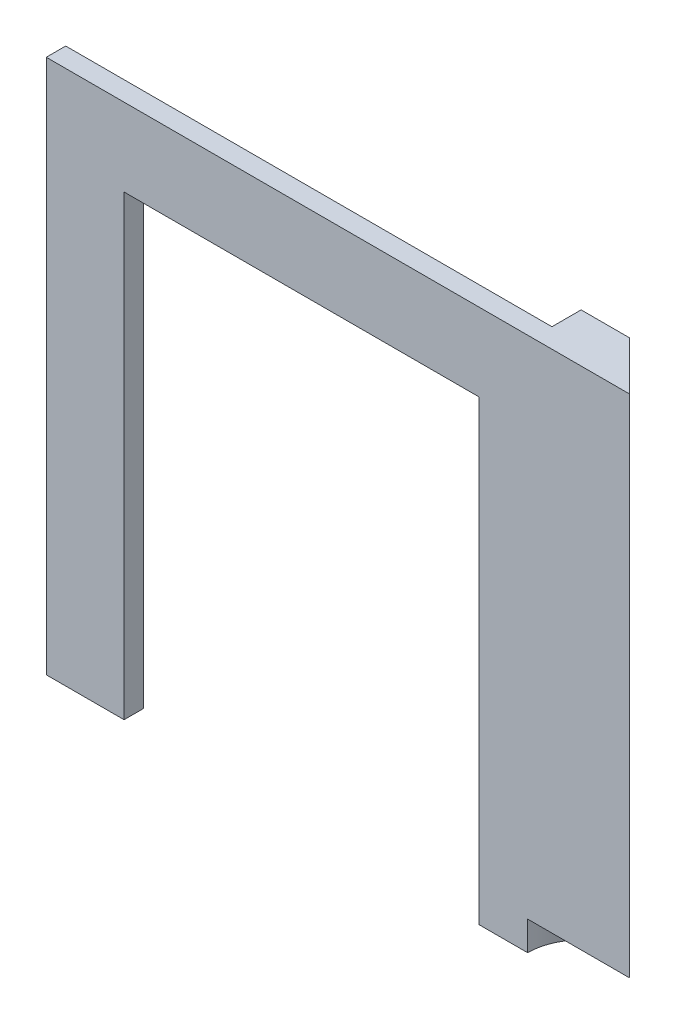
ISO-10303-21;
HEADER;
FILE_DESCRIPTION(('STEP AP214'),'2;1');
FILE_NAME('part.step','',(''),(''),'','','');
FILE_SCHEMA(('AUTOMOTIVE_DESIGN { 1 0 10303 214 1 1 1 1 }'));
ENDSEC;
DATA;
#1=APPLICATION_CONTEXT('core data for automotive mechanical design processes');
#2=APPLICATION_PROTOCOL_DEFINITION('international standard','automotive_design',2000,#1);
#3=PRODUCT_CONTEXT('',#1,'mechanical');
#4=PRODUCT('Part','Part','',(#3));
#5=PRODUCT_RELATED_PRODUCT_CATEGORY('part','',(#4));
#6=PRODUCT_DEFINITION_FORMATION('','',#4);
#7=PRODUCT_DEFINITION_CONTEXT('part definition',#1,'design');
#8=PRODUCT_DEFINITION('design','',#6,#7);
#9=PRODUCT_DEFINITION_SHAPE('','',#8);
#10=(LENGTH_UNIT() NAMED_UNIT(*) SI_UNIT(.MILLI.,.METRE.));
#11=(NAMED_UNIT(*) PLANE_ANGLE_UNIT() SI_UNIT($,.RADIAN.));
#12=(NAMED_UNIT(*) SI_UNIT($,.STERADIAN.) SOLID_ANGLE_UNIT());
#13=UNCERTAINTY_MEASURE_WITH_UNIT(LENGTH_MEASURE(1.E-05),#10,'distance_accuracy_value','');
#14=(GEOMETRIC_REPRESENTATION_CONTEXT(3) GLOBAL_UNCERTAINTY_ASSIGNED_CONTEXT((#13)) GLOBAL_UNIT_ASSIGNED_CONTEXT((#10,
#11,#12)) REPRESENTATION_CONTEXT('',''));
#15=CARTESIAN_POINT('',(0.,0.,0.));
#16=DIRECTION('',(0.,0.,1.));
#17=DIRECTION('',(1.,0.,0.));
#18=AXIS2_PLACEMENT_3D('',#15,#16,#17);
#19=CARTESIAN_POINT('',(34.0000000000006,55.,2.49999999999978));
#20=DIRECTION('',(-0.707106781186551,0.,0.707106781186544));
#21=DIRECTION('',(0.707106781186544,0.,0.707106781186551));
#22=AXIS2_PLACEMENT_3D('',#19,#20,#21);
#23=PLANE('',#22);
#24=DIRECTION('',(0.707106781186544,0.,0.707106781186551));
#25=VECTOR('',#24,1.);
#26=CARTESIAN_POINT('',(34.0000000000006,3.,2.49999999999978));
#27=LINE('',#26,#25);
#28=CARTESIAN_POINT('',(29.0000000000009,3.,-2.49999999999996));
#29=VERTEX_POINT('',#28);
#30=CARTESIAN_POINT('',(34.0000000000006,3.,2.49999999999978));
#31=VERTEX_POINT('',#30);
#32=EDGE_CURVE('E182',#29,#31,#27,.T.);
#33=ORIENTED_EDGE('',*,*,#32,.F.);
#34=DIRECTION('',(0.,-1.,0.));
#35=VECTOR('',#34,1.);
#36=CARTESIAN_POINT('',(29.0000000000009,55.,-2.49999999999996));
#37=LINE('',#36,#35);
#38=CARTESIAN_POINT('',(29.0000000000009,55.,-2.49999999999996));
#39=VERTEX_POINT('',#38);
#40=EDGE_CURVE('E174',#39,#29,#37,.T.);
#41=ORIENTED_EDGE('',*,*,#40,.F.);
#42=DIRECTION('',(-0.707106781186544,0.,-0.707106781186551));
#43=VECTOR('',#42,1.);
#44=CARTESIAN_POINT('',(34.0000000000006,55.,2.49999999999978));
#45=LINE('',#44,#43);
#46=CARTESIAN_POINT('',(34.0000000000006,55.,2.49999999999978));
#47=VERTEX_POINT('',#46);
#48=EDGE_CURVE('E197',#47,#39,#45,.T.);
#49=ORIENTED_EDGE('',*,*,#48,.F.);
#50=DIRECTION('',(0.,-1.,0.));
#51=VECTOR('',#50,1.);
#52=CARTESIAN_POINT('',(34.0000000000006,55.,2.49999999999978));
#53=LINE('',#52,#51);
#54=EDGE_CURVE('E177',#47,#31,#53,.T.);
#55=ORIENTED_EDGE('',*,*,#54,.T.);
#56=EDGE_LOOP('',(#33,#41,#49,#55));
#57=FACE_BOUND('',#56,.T.);
#58=ADVANCED_FACE('F32',(#57),#23,.F.);
#59=CARTESIAN_POINT('',(0.,0.,0.));
#60=DIRECTION('',(0.,-1.,0.));
#61=DIRECTION('',(0.,0.,-1.));
#62=AXIS2_PLACEMENT_3D('',#59,#60,#61);
#63=PLANE('',#62);
#64=CARTESIAN_POINT('',(29.0000000000049,0.,2.50000000000047));
#65=DIRECTION('',(0.,-1.,0.));
#66=DIRECTION('',(0.,0.,-1.));
#67=AXIS2_PLACEMENT_3D('',#64,#65,#66);
#68=CIRCLE('',#67,5.5);
#69=CARTESIAN_POINT('',(23.5000000000049,0.,2.49999999999978));
#70=VERTEX_POINT('',#69);
#71=CARTESIAN_POINT('',(26.7087121525279,0.,-2.49999999999996));
#72=VERTEX_POINT('',#71);
#73=EDGE_CURVE('E127',#70,#72,#68,.T.);
#74=ORIENTED_EDGE('',*,*,#73,.F.);
#75=DIRECTION('',(1.,0.,0.));
#76=VECTOR('',#75,1.);
#77=CARTESIAN_POINT('',(-26.0000000000006,0.,2.49999999999978));
#78=LINE('',#77,#76);
#79=CARTESIAN_POINT('',(18.4999999999994,0.,2.49999999999978));
#80=VERTEX_POINT('',#79);
#81=EDGE_CURVE('E139',#80,#70,#78,.T.);
#82=ORIENTED_EDGE('',*,*,#81,.F.);
#83=DIRECTION('',(0.,0.,1.));
#84=VECTOR('',#83,1.);
#85=CARTESIAN_POINT('',(18.4999999999994,0.,-2.49999999999996));
#86=LINE('',#85,#84);
#87=CARTESIAN_POINT('',(18.4999999999994,0.,-2.49999999999996));
#88=VERTEX_POINT('',#87);
#89=EDGE_CURVE('E158',#88,#80,#86,.T.);
#90=ORIENTED_EDGE('',*,*,#89,.F.);
#91=DIRECTION('',(-1.,0.,0.));
#92=VECTOR('',#91,1.);
#93=CARTESIAN_POINT('',(29.0000000000009,0.,-2.49999999999996));
#94=LINE('',#93,#92);
#95=EDGE_CURVE('E140',#72,#88,#94,.T.);
#96=ORIENTED_EDGE('',*,*,#95,.F.);
#97=EDGE_LOOP('',(#74,#82,#90,#96));
#98=FACE_BOUND('',#97,.T.);
#99=ADVANCED_FACE('F137',(#98),#63,.T.);
#100=CARTESIAN_POINT('',(-26.0000000000006,55.,2.49999999999978));
#101=DIRECTION('',(0.,0.,-1.));
#102=DIRECTION('',(-1.,0.,0.));
#103=AXIS2_PLACEMENT_3D('',#100,#101,#102);
#104=PLANE('',#103);
#105=ORIENTED_EDGE('',*,*,#81,.T.);
#106=DIRECTION('',(0.,-1.,0.));
#107=VECTOR('',#106,1.);
#108=CARTESIAN_POINT('',(23.5000000000049,3.,2.49999999999978));
#109=LINE('',#108,#107);
#110=CARTESIAN_POINT('',(23.5000000000049,3.,2.49999999999978));
#111=VERTEX_POINT('',#110);
#112=EDGE_CURVE('E124',#70,#111,#109,.F.);
#113=ORIENTED_EDGE('',*,*,#112,.T.);
#114=DIRECTION('',(-1.,0.,0.));
#115=VECTOR('',#114,1.);
#116=CARTESIAN_POINT('',(-26.0000000000006,3.,2.49999999999978));
#117=LINE('',#116,#115);
#118=EDGE_CURVE('E132',#31,#111,#117,.T.);
#119=ORIENTED_EDGE('',*,*,#118,.F.);
#120=ORIENTED_EDGE('',*,*,#54,.F.);
#121=DIRECTION('',(1.,0.,0.));
#122=VECTOR('',#121,1.);
#123=CARTESIAN_POINT('',(-26.0000000000006,55.,2.49999999999978));
#124=LINE('',#123,#122);
#125=CARTESIAN_POINT('',(-26.0000000000006,55.,2.49999999999978));
#126=VERTEX_POINT('',#125);
#127=EDGE_CURVE('E164',#126,#47,#124,.T.);
#128=ORIENTED_EDGE('',*,*,#127,.F.);
#129=DIRECTION('',(0.,-1.,0.));
#130=VECTOR('',#129,1.);
#131=CARTESIAN_POINT('',(-26.0000000000006,55.,2.49999999999978));
#132=LINE('',#131,#130);
#133=CARTESIAN_POINT('',(-26.0000000000006,0.,2.49999999999978));
#134=VERTEX_POINT('',#133);
#135=EDGE_CURVE('E165',#126,#134,#132,.T.);
#136=ORIENTED_EDGE('',*,*,#135,.T.);
#137=CARTESIAN_POINT('',(-18.0000000000006,0.,2.49999999999978));
#138=VERTEX_POINT('',#137);
#139=EDGE_CURVE('E146',#134,#138,#78,.T.);
#140=ORIENTED_EDGE('',*,*,#139,.T.);
#141=DIRECTION('',(0.,1.,0.));
#142=VECTOR('',#141,1.);
#143=CARTESIAN_POINT('',(-18.0000000000006,0.,2.49999999999979));
#144=LINE('',#143,#142);
#145=CARTESIAN_POINT('',(-18.0000000000006,47.,2.49999999999979));
#146=VERTEX_POINT('',#145);
#147=EDGE_CURVE('E215',#138,#146,#144,.T.);
#148=ORIENTED_EDGE('',*,*,#147,.T.);
#149=DIRECTION('',(1.,0.,0.));
#150=VECTOR('',#149,1.);
#151=CARTESIAN_POINT('',(18.4999999999994,47.,2.49999999999978));
#152=LINE('',#151,#150);
#153=CARTESIAN_POINT('',(18.4999999999994,47.,2.49999999999978));
#154=VERTEX_POINT('',#153);
#155=EDGE_CURVE('E205',#146,#154,#152,.T.);
#156=ORIENTED_EDGE('',*,*,#155,.T.);
#157=DIRECTION('',(0.,-1.,0.));
#158=VECTOR('',#157,1.);
#159=CARTESIAN_POINT('',(18.4999999999994,0.,2.49999999999978));
#160=LINE('',#159,#158);
#161=EDGE_CURVE('E145',#154,#80,#160,.T.);
#162=ORIENTED_EDGE('',*,*,#161,.T.);
#163=EDGE_LOOP('',(#105,#113,#119,#120,#128,#136,#140,#148,#156,#162));
#164=FACE_BOUND('',#163,.T.);
#165=ADVANCED_FACE('F34',(#164),#104,.F.);
#166=CARTESIAN_POINT('',(29.0000000000009,55.,-2.49999999999996));
#167=DIRECTION('',(0.,0.,1.));
#168=DIRECTION('',(1.,0.,0.));
#169=AXIS2_PLACEMENT_3D('',#166,#167,#168);
#170=PLANE('',#169);
#171=DIRECTION('',(1.,0.,0.));
#172=VECTOR('',#171,1.);
#173=CARTESIAN_POINT('',(29.0000000000009,3.,-2.49999999999996));
#174=LINE('',#173,#172);
#175=CARTESIAN_POINT('',(26.7087121525279,3.,-2.49999999999996));
#176=VERTEX_POINT('',#175);
#177=EDGE_CURVE('E40',#176,#29,#174,.T.);
#178=ORIENTED_EDGE('',*,*,#177,.F.);
#179=DIRECTION('',(0.,-1.,0.));
#180=VECTOR('',#179,1.);
#181=CARTESIAN_POINT('',(26.7087121525279,3.,-2.49999999999996));
#182=LINE('',#181,#180);
#183=EDGE_CURVE('E11',#176,#72,#182,.T.);
#184=ORIENTED_EDGE('',*,*,#183,.T.);
#185=ORIENTED_EDGE('',*,*,#95,.T.);
#186=DIRECTION('',(0.,-1.,0.));
#187=VECTOR('',#186,1.);
#188=CARTESIAN_POINT('',(18.4999999999994,55.,-2.49999999999996));
#189=LINE('',#188,#187);
#190=CARTESIAN_POINT('',(18.4999999999994,47.,-2.49999999999996));
#191=VERTEX_POINT('',#190);
#192=EDGE_CURVE('E171',#191,#88,#189,.T.);
#193=ORIENTED_EDGE('',*,*,#192,.F.);
#194=DIRECTION('',(-1.,0.,0.));
#195=VECTOR('',#194,1.);
#196=CARTESIAN_POINT('',(18.4999999999994,47.,-2.49999999999996));
#197=LINE('',#196,#195);
#198=CARTESIAN_POINT('',(24.0000000000006,47.,-2.49999999999996));
#199=VERTEX_POINT('',#198);
#200=EDGE_CURVE('E222',#199,#191,#197,.T.);
#201=ORIENTED_EDGE('',*,*,#200,.F.);
#202=DIRECTION('',(0.,-1.,0.));
#203=VECTOR('',#202,1.);
#204=CARTESIAN_POINT('',(24.0000000000006,55.,-2.49999999999996));
#205=LINE('',#204,#203);
#206=CARTESIAN_POINT('',(24.0000000000006,55.,-2.49999999999996));
#207=VERTEX_POINT('',#206);
#208=EDGE_CURVE('E131',#207,#199,#205,.T.);
#209=ORIENTED_EDGE('',*,*,#208,.F.);
#210=DIRECTION('',(-1.,0.,0.));
#211=VECTOR('',#210,1.);
#212=CARTESIAN_POINT('',(29.0000000000009,55.,-2.49999999999996));
#213=LINE('',#212,#211);
#214=EDGE_CURVE('E192',#39,#207,#213,.T.);
#215=ORIENTED_EDGE('',*,*,#214,.F.);
#216=ORIENTED_EDGE('',*,*,#40,.T.);
#217=EDGE_LOOP('',(#178,#184,#185,#193,#201,#209,#215,#216));
#218=FACE_BOUND('',#217,.T.);
#219=ADVANCED_FACE('F189',(#218),#170,.F.);
#220=CARTESIAN_POINT('',(18.4999999999994,55.,-2.49999999999996));
#221=DIRECTION('',(1.,0.,0.));
#222=DIRECTION('',(0.,0.,-1.));
#223=AXIS2_PLACEMENT_3D('',#220,#221,#222);
#224=PLANE('',#223);
#225=DIRECTION('',(0.,0.,-1.));
#226=VECTOR('',#225,1.);
#227=CARTESIAN_POINT('',(18.4999999999994,47.,2.49999999999978));
#228=LINE('',#227,#226);
#229=CARTESIAN_POINT('',(18.4999999999994,47.,0.500000000000273));
#230=VERTEX_POINT('',#229);
#231=EDGE_CURVE('E147',#154,#230,#228,.T.);
#232=ORIENTED_EDGE('',*,*,#231,.T.);
#233=DIRECTION('',(0.,0.,-1.));
#234=VECTOR('',#233,1.);
#235=CARTESIAN_POINT('',(18.4999999999994,47.,10.2082439194748));
#236=LINE('',#235,#234);
#237=EDGE_CURVE('E213',#230,#191,#236,.T.);
#238=ORIENTED_EDGE('',*,*,#237,.T.);
#239=ORIENTED_EDGE('',*,*,#192,.T.);
#240=ORIENTED_EDGE('',*,*,#89,.T.);
#241=ORIENTED_EDGE('',*,*,#161,.F.);
#242=EDGE_LOOP('',(#232,#238,#239,#240,#241));
#243=FACE_BOUND('',#242,.T.);
#244=ADVANCED_FACE('F254',(#243),#224,.F.);
#245=CARTESIAN_POINT('',(18.4999999999994,55.,0.500000000000272));
#246=DIRECTION('',(0.,0.,1.));
#247=DIRECTION('',(1.,0.,0.));
#248=AXIS2_PLACEMENT_3D('',#245,#246,#247);
#249=PLANE('',#248);
#250=DIRECTION('',(-1.,0.,0.));
#251=VECTOR('',#250,1.);
#252=CARTESIAN_POINT('',(18.4999999999994,55.,0.500000000000272));
#253=LINE('',#252,#251);
#254=CARTESIAN_POINT('',(24.0000000000006,55.,0.500000000000273));
#255=VERTEX_POINT('',#254);
#256=CARTESIAN_POINT('',(-26.0000000000006,55.,0.500000000000278));
#257=VERTEX_POINT('',#256);
#258=EDGE_CURVE('E55',#255,#257,#253,.T.);
#259=ORIENTED_EDGE('',*,*,#258,.F.);
#260=DIRECTION('',(0.,-1.,0.));
#261=VECTOR('',#260,1.);
#262=CARTESIAN_POINT('',(24.0000000000006,55.,0.500000000000273));
#263=LINE('',#262,#261);
#264=CARTESIAN_POINT('',(24.0000000000006,47.,0.500000000000273));
#265=VERTEX_POINT('',#264);
#266=EDGE_CURVE('E221',#255,#265,#263,.T.);
#267=ORIENTED_EDGE('',*,*,#266,.T.);
#268=DIRECTION('',(-1.,0.,0.));
#269=VECTOR('',#268,1.);
#270=CARTESIAN_POINT('',(18.4999999999994,47.,0.500000000000273));
#271=LINE('',#270,#269);
#272=EDGE_CURVE('E225',#265,#230,#271,.T.);
#273=ORIENTED_EDGE('',*,*,#272,.T.);
#274=DIRECTION('',(1.,0.,0.));
#275=VECTOR('',#274,1.);
#276=CARTESIAN_POINT('',(18.4999999999994,47.,0.500000000000272));
#277=LINE('',#276,#275);
#278=CARTESIAN_POINT('',(-18.0000000000006,47.,0.500000000000277));
#279=VERTEX_POINT('',#278);
#280=EDGE_CURVE('E207',#279,#230,#277,.T.);
#281=ORIENTED_EDGE('',*,*,#280,.F.);
#282=DIRECTION('',(0.,1.,0.));
#283=VECTOR('',#282,1.);
#284=CARTESIAN_POINT('',(-18.0000000000006,0.,0.500000000000277));
#285=LINE('',#284,#283);
#286=CARTESIAN_POINT('',(-18.0000000000006,0.,0.500000000000277));
#287=VERTEX_POINT('',#286);
#288=EDGE_CURVE('E210',#287,#279,#285,.T.);
#289=ORIENTED_EDGE('',*,*,#288,.F.);
#290=DIRECTION('',(-1.,0.,0.));
#291=VECTOR('',#290,1.);
#292=CARTESIAN_POINT('',(18.4999999999994,0.,0.500000000000272));
#293=LINE('',#292,#291);
#294=CARTESIAN_POINT('',(-26.0000000000006,0.,0.500000000000278));
#295=VERTEX_POINT('',#294);
#296=EDGE_CURVE('E160',#287,#295,#293,.T.);
#297=ORIENTED_EDGE('',*,*,#296,.T.);
#298=DIRECTION('',(0.,-1.,0.));
#299=VECTOR('',#298,1.);
#300=CARTESIAN_POINT('',(-26.0000000000006,55.,0.500000000000278));
#301=LINE('',#300,#299);
#302=EDGE_CURVE('E168',#257,#295,#301,.T.);
#303=ORIENTED_EDGE('',*,*,#302,.F.);
#304=EDGE_LOOP('',(#259,#267,#273,#281,#289,#297,#303));
#305=FACE_BOUND('',#304,.T.);
#306=ADVANCED_FACE('F261',(#305),#249,.F.);
#307=CARTESIAN_POINT('',(-26.0000000000006,55.,0.500000000000278));
#308=DIRECTION('',(1.,0.,0.));
#309=DIRECTION('',(0.,0.,-1.));
#310=AXIS2_PLACEMENT_3D('',#307,#308,#309);
#311=PLANE('',#310);
#312=DIRECTION('',(0.,0.,1.));
#313=VECTOR('',#312,1.);
#314=CARTESIAN_POINT('',(-26.0000000000006,0.,0.500000000000278));
#315=LINE('',#314,#313);
#316=EDGE_CURVE('E162',#295,#134,#315,.T.);
#317=ORIENTED_EDGE('',*,*,#316,.T.);
#318=ORIENTED_EDGE('',*,*,#135,.F.);
#319=DIRECTION('',(0.,0.,1.));
#320=VECTOR('',#319,1.);
#321=CARTESIAN_POINT('',(-26.0000000000006,55.,0.500000000000278));
#322=LINE('',#321,#320);
#323=EDGE_CURVE('E155',#257,#126,#322,.T.);
#324=ORIENTED_EDGE('',*,*,#323,.F.);
#325=ORIENTED_EDGE('',*,*,#302,.T.);
#326=EDGE_LOOP('',(#317,#318,#324,#325));
#327=FACE_BOUND('',#326,.T.);
#328=ADVANCED_FACE('F240',(#327),#311,.F.);
#329=CARTESIAN_POINT('',(0.,55.,0.));
#330=DIRECTION('',(0.,-1.,0.));
#331=DIRECTION('',(0.,0.,-1.));
#332=AXIS2_PLACEMENT_3D('',#329,#330,#331);
#333=PLANE('',#332);
#334=DIRECTION('',(0.,0.,-1.));
#335=VECTOR('',#334,1.);
#336=CARTESIAN_POINT('',(24.0000000000006,55.,10.2082439194748));
#337=LINE('',#336,#335);
#338=EDGE_CURVE('E219',#255,#207,#337,.T.);
#339=ORIENTED_EDGE('',*,*,#338,.F.);
#340=ORIENTED_EDGE('',*,*,#258,.T.);
#341=ORIENTED_EDGE('',*,*,#323,.T.);
#342=ORIENTED_EDGE('',*,*,#127,.T.);
#343=ORIENTED_EDGE('',*,*,#48,.T.);
#344=ORIENTED_EDGE('',*,*,#214,.T.);
#345=EDGE_LOOP('',(#339,#340,#341,#342,#343,#344));
#346=FACE_BOUND('',#345,.T.);
#347=ADVANCED_FACE('F237',(#346),#333,.F.);
#348=DIRECTION('',(0.,0.,-1.));
#349=VECTOR('',#348,1.);
#350=CARTESIAN_POINT('',(-18.0000000000006,0.,2.49999999999979));
#351=LINE('',#350,#349);
#352=EDGE_CURVE('E203',#138,#287,#351,.T.);
#353=ORIENTED_EDGE('',*,*,#352,.F.);
#354=ORIENTED_EDGE('',*,*,#139,.F.);
#355=ORIENTED_EDGE('',*,*,#316,.F.);
#356=ORIENTED_EDGE('',*,*,#296,.F.);
#357=EDGE_LOOP('',(#353,#354,#355,#356));
#358=FACE_BOUND('',#357,.T.);
#359=ADVANCED_FACE('F245',(#358),#63,.T.);
#360=CARTESIAN_POINT('',(18.4999999999994,47.,2.49999999999978));
#361=DIRECTION('',(0.,1.,0.));
#362=DIRECTION('',(0.,0.,1.));
#363=AXIS2_PLACEMENT_3D('',#360,#361,#362);
#364=PLANE('',#363);
#365=ORIENTED_EDGE('',*,*,#280,.T.);
#366=ORIENTED_EDGE('',*,*,#231,.F.);
#367=ORIENTED_EDGE('',*,*,#155,.F.);
#368=DIRECTION('',(0.,0.,-1.));
#369=VECTOR('',#368,1.);
#370=CARTESIAN_POINT('',(-18.0000000000006,47.,2.49999999999979));
#371=LINE('',#370,#369);
#372=EDGE_CURVE('E151',#146,#279,#371,.T.);
#373=ORIENTED_EDGE('',*,*,#372,.T.);
#374=EDGE_LOOP('',(#365,#366,#367,#373));
#375=FACE_BOUND('',#374,.T.);
#376=ADVANCED_FACE('F252',(#375),#364,.F.);
#377=CARTESIAN_POINT('',(-18.0000000000006,0.,2.49999999999979));
#378=DIRECTION('',(-1.,0.,0.));
#379=DIRECTION('',(0.,0.,1.));
#380=AXIS2_PLACEMENT_3D('',#377,#378,#379);
#381=PLANE('',#380);
#382=ORIENTED_EDGE('',*,*,#288,.T.);
#383=ORIENTED_EDGE('',*,*,#372,.F.);
#384=ORIENTED_EDGE('',*,*,#147,.F.);
#385=ORIENTED_EDGE('',*,*,#352,.T.);
#386=EDGE_LOOP('',(#382,#383,#384,#385));
#387=FACE_BOUND('',#386,.T.);
#388=ADVANCED_FACE('F248',(#387),#381,.F.);
#389=CARTESIAN_POINT('',(24.0000000000006,55.,10.2082439194748));
#390=DIRECTION('',(1.,0.,0.));
#391=DIRECTION('',(0.,0.,-1.));
#392=AXIS2_PLACEMENT_3D('',#389,#390,#391);
#393=PLANE('',#392);
#394=ORIENTED_EDGE('',*,*,#338,.T.);
#395=ORIENTED_EDGE('',*,*,#208,.T.);
#396=DIRECTION('',(0.,0.,-1.));
#397=VECTOR('',#396,1.);
#398=CARTESIAN_POINT('',(24.0000000000006,47.,10.2082439194748));
#399=LINE('',#398,#397);
#400=EDGE_CURVE('E223',#265,#199,#399,.T.);
#401=ORIENTED_EDGE('',*,*,#400,.F.);
#402=ORIENTED_EDGE('',*,*,#266,.F.);
#403=EDGE_LOOP('',(#394,#395,#401,#402));
#404=FACE_BOUND('',#403,.T.);
#405=ADVANCED_FACE('F260',(#404),#393,.F.);
#406=CARTESIAN_POINT('',(18.4999999999994,47.,10.2082439194748));
#407=DIRECTION('',(0.,-1.,0.));
#408=DIRECTION('',(0.,0.,-1.));
#409=AXIS2_PLACEMENT_3D('',#406,#407,#408);
#410=PLANE('',#409);
#411=ORIENTED_EDGE('',*,*,#400,.T.);
#412=ORIENTED_EDGE('',*,*,#200,.T.);
#413=ORIENTED_EDGE('',*,*,#237,.F.);
#414=ORIENTED_EDGE('',*,*,#272,.F.);
#415=EDGE_LOOP('',(#411,#412,#413,#414));
#416=FACE_BOUND('',#415,.T.);
#417=ADVANCED_FACE('F257',(#416),#410,.F.);
#418=CARTESIAN_POINT('',(29.0000000000049,3.,2.50000000000047));
#419=DIRECTION('',(0.,-1.,0.));
#420=DIRECTION('',(0.,0.,-1.));
#421=AXIS2_PLACEMENT_3D('',#418,#419,#420);
#422=CYLINDRICAL_SURFACE('',#421,5.5);
#423=ORIENTED_EDGE('',*,*,#73,.T.);
#424=ORIENTED_EDGE('',*,*,#183,.F.);
#425=CARTESIAN_POINT('',(29.0000000000049,3.,2.50000000000047));
#426=DIRECTION('',(0.,-1.,0.));
#427=DIRECTION('',(0.,0.,-1.));
#428=AXIS2_PLACEMENT_3D('',#425,#426,#427);
#429=CIRCLE('',#428,5.5);
#430=EDGE_CURVE('E47',#111,#176,#429,.T.);
#431=ORIENTED_EDGE('',*,*,#430,.F.);
#432=ORIENTED_EDGE('',*,*,#112,.F.);
#433=EDGE_LOOP('',(#423,#424,#431,#432));
#434=FACE_BOUND('',#433,.T.);
#435=ADVANCED_FACE('F126',(#434),#422,.F.);
#436=CARTESIAN_POINT('',(29.0000000000049,3.,2.50000000000047));
#437=DIRECTION('',(0.,-1.,0.));
#438=DIRECTION('',(0.,0.,-1.));
#439=AXIS2_PLACEMENT_3D('',#436,#437,#438);
#440=PLANE('',#439);
#441=ORIENTED_EDGE('',*,*,#118,.T.);
#442=ORIENTED_EDGE('',*,*,#430,.T.);
#443=ORIENTED_EDGE('',*,*,#177,.T.);
#444=ORIENTED_EDGE('',*,*,#32,.T.);
#445=EDGE_LOOP('',(#441,#442,#443,#444));
#446=FACE_BOUND('',#445,.T.);
#447=ADVANCED_FACE('F181',(#446),#440,.T.);
#448=CLOSED_SHELL('',(#58,#99,#165,#219,#244,#306,#328,#347,#359,#376,#388,#405,#417,#435,#447));
#449=MANIFOLD_SOLID_BREP('B2',#448);
#450=ADVANCED_BREP_SHAPE_REPRESENTATION('',(#18,#449),#14);
#451=SHAPE_DEFINITION_REPRESENTATION(#9,#450);
ENDSEC;
END-ISO-10303-21;
